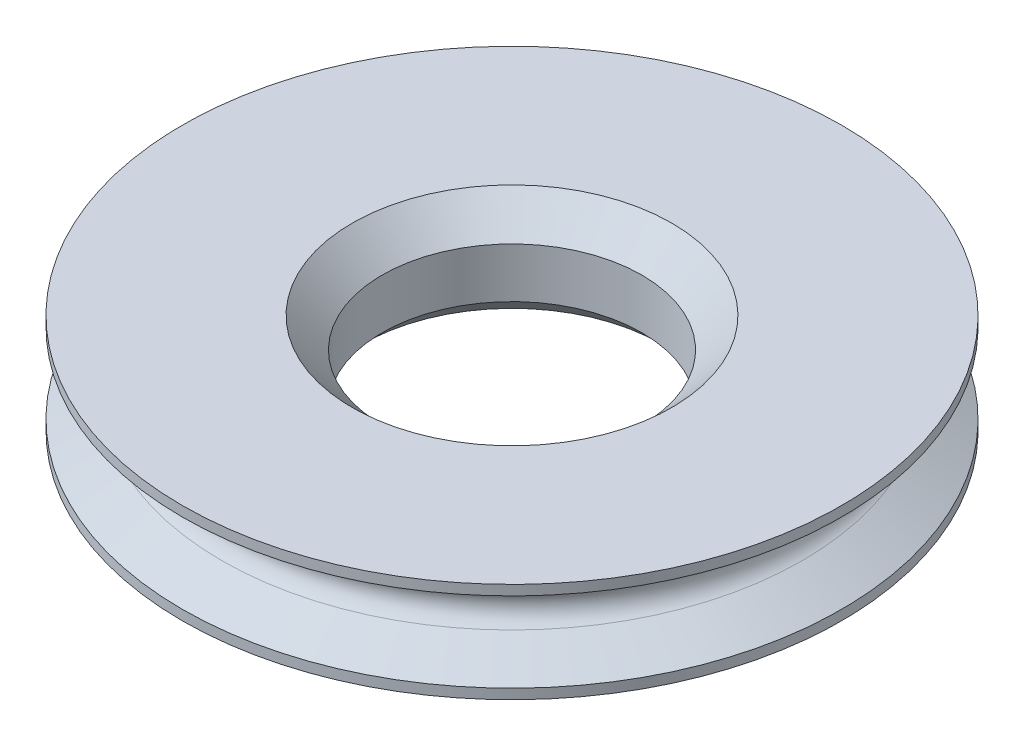
ISO-10303-21;
HEADER;
FILE_DESCRIPTION(('STEP AP214'),'2;1');
FILE_NAME('part.step','',(''),(''),'','','');
FILE_SCHEMA(('AUTOMOTIVE_DESIGN { 1 0 10303 214 1 1 1 1 }'));
ENDSEC;
DATA;
#1=APPLICATION_CONTEXT('core data for automotive mechanical design processes');
#2=APPLICATION_PROTOCOL_DEFINITION('international standard','automotive_design',2000,#1);
#3=PRODUCT_CONTEXT('',#1,'mechanical');
#4=PRODUCT('Part','Part','',(#3));
#5=PRODUCT_RELATED_PRODUCT_CATEGORY('part','',(#4));
#6=PRODUCT_DEFINITION_FORMATION('','',#4);
#7=PRODUCT_DEFINITION_CONTEXT('part definition',#1,'design');
#8=PRODUCT_DEFINITION('design','',#6,#7);
#9=PRODUCT_DEFINITION_SHAPE('','',#8);
#10=(LENGTH_UNIT() NAMED_UNIT(*) SI_UNIT(.MILLI.,.METRE.));
#11=(NAMED_UNIT(*) PLANE_ANGLE_UNIT() SI_UNIT($,.RADIAN.));
#12=(NAMED_UNIT(*) SI_UNIT($,.STERADIAN.) SOLID_ANGLE_UNIT());
#13=UNCERTAINTY_MEASURE_WITH_UNIT(LENGTH_MEASURE(1.E-05),#10,'distance_accuracy_value','');
#14=(GEOMETRIC_REPRESENTATION_CONTEXT(3) GLOBAL_UNCERTAINTY_ASSIGNED_CONTEXT((#13)) GLOBAL_UNIT_ASSIGNED_CONTEXT((#10,
#11,#12)) REPRESENTATION_CONTEXT('',''));
#15=CARTESIAN_POINT('',(0.,0.,0.));
#16=DIRECTION('',(0.,0.,1.));
#17=DIRECTION('',(1.,0.,0.));
#18=AXIS2_PLACEMENT_3D('',#15,#16,#17);
#19=CARTESIAN_POINT('',(41.91,6.35,0.));
#20=DIRECTION('',(0.,-1.,0.));
#21=DIRECTION('',(0.,0.,-1.));
#22=AXIS2_PLACEMENT_3D('',#19,#20,#21);
#23=TOROIDAL_SURFACE('',#22,38.1911818975501,2.54);
#24=CARTESIAN_POINT('',(41.91,8.54970452561248,0.));
#25=DIRECTION('',(0.,-1.,0.));
#26=DIRECTION('',(0.,0.,-1.));
#27=AXIS2_PLACEMENT_3D('',#24,#25,#26);
#28=CIRCLE('',#27,36.9211818975501);
#29=CARTESIAN_POINT('',(41.91,8.54970452561248,-36.9211818975501));
#30=VERTEX_POINT('',#29);
#31=EDGE_CURVE('E74',#30,#30,#28,.T.);
#32=ORIENTED_EDGE('',*,*,#31,.T.);
#33=EDGE_LOOP('',(#32));
#34=FACE_BOUND('',#33,.T.);
#35=CARTESIAN_POINT('',(41.91,4.15029547438753,0.));
#36=DIRECTION('',(0.,-1.,0.));
#37=DIRECTION('',(0.,0.,-1.));
#38=AXIS2_PLACEMENT_3D('',#35,#36,#37);
#39=CIRCLE('',#38,36.9211818975501);
#40=CARTESIAN_POINT('',(41.91,4.15029547438753,-36.9211818975501));
#41=VERTEX_POINT('',#40);
#42=EDGE_CURVE('E10',#41,#41,#39,.T.);
#43=ORIENTED_EDGE('',*,*,#42,.F.);
#44=EDGE_LOOP('',(#43));
#45=FACE_BOUND('',#44,.T.);
#46=ADVANCED_FACE('F40',(#34,#45),#23,.F.);
#47=CARTESIAN_POINT('',(41.91,4.15029547438753,0.));
#48=DIRECTION('',(0.,-1.,0.));
#49=DIRECTION('',(0.,0.,-1.));
#50=AXIS2_PLACEMENT_3D('',#47,#48,#49);
#51=CONICAL_SURFACE('',#50,36.9211818975501,1.0471975511966);
#52=CARTESIAN_POINT('',(41.91,1.27,0.));
#53=DIRECTION('',(0.,-1.,0.));
#54=DIRECTION('',(0.,0.,-1.));
#55=AXIS2_PLACEMENT_3D('',#52,#53,#54);
#56=CIRCLE('',#55,41.91);
#57=CARTESIAN_POINT('',(41.91,1.27,-41.91));
#58=VERTEX_POINT('',#57);
#59=EDGE_CURVE('E46',#58,#58,#56,.T.);
#60=ORIENTED_EDGE('',*,*,#59,.F.);
#61=EDGE_LOOP('',(#60));
#62=FACE_BOUND('',#61,.T.);
#63=ORIENTED_EDGE('',*,*,#42,.T.);
#64=EDGE_LOOP('',(#63));
#65=FACE_BOUND('',#64,.T.);
#66=ADVANCED_FACE('F92',(#62,#65),#51,.T.);
#67=CARTESIAN_POINT('',(41.91,0.,0.));
#68=DIRECTION('',(0.,-1.,0.));
#69=DIRECTION('',(0.,0.,-1.));
#70=AXIS2_PLACEMENT_3D('',#67,#68,#69);
#71=CYLINDRICAL_SURFACE('',#70,41.91);
#72=ORIENTED_EDGE('',*,*,#59,.T.);
#73=EDGE_LOOP('',(#72));
#74=FACE_BOUND('',#73,.T.);
#75=CARTESIAN_POINT('',(41.91,0.,0.));
#76=DIRECTION('',(0.,-1.,0.));
#77=DIRECTION('',(0.,0.,-1.));
#78=AXIS2_PLACEMENT_3D('',#75,#76,#77);
#79=CIRCLE('',#78,41.91);
#80=CARTESIAN_POINT('',(41.91,0.,-41.91));
#81=VERTEX_POINT('',#80);
#82=EDGE_CURVE('E50',#81,#81,#79,.T.);
#83=ORIENTED_EDGE('',*,*,#82,.F.);
#84=EDGE_LOOP('',(#83));
#85=FACE_BOUND('',#84,.T.);
#86=ADVANCED_FACE('F96',(#74,#85),#71,.T.);
#87=CARTESIAN_POINT('',(0.,0.,0.));
#88=DIRECTION('',(0.,1.,0.));
#89=DIRECTION('',(0.,0.,1.));
#90=AXIS2_PLACEMENT_3D('',#87,#88,#89);
#91=PLANE('',#90);
#92=CARTESIAN_POINT('',(41.91,0.,0.));
#93=DIRECTION('',(0.,-1.,0.));
#94=DIRECTION('',(0.,0.,-1.));
#95=AXIS2_PLACEMENT_3D('',#92,#93,#94);
#96=CIRCLE('',#95,19.05);
#97=CARTESIAN_POINT('',(41.91,0.,-19.05));
#98=VERTEX_POINT('',#97);
#99=EDGE_CURVE('E54',#98,#98,#96,.T.);
#100=ORIENTED_EDGE('',*,*,#99,.F.);
#101=EDGE_LOOP('',(#100));
#102=FACE_BOUND('',#101,.T.);
#103=ORIENTED_EDGE('',*,*,#82,.T.);
#104=EDGE_LOOP('',(#103));
#105=FACE_BOUND('',#104,.T.);
#106=ADVANCED_FACE('F101',(#102,#105),#91,.F.);
#107=CARTESIAN_POINT('',(41.91,0.,0.));
#108=DIRECTION('',(0.,-1.,0.));
#109=DIRECTION('',(0.,0.,-1.));
#110=AXIS2_PLACEMENT_3D('',#107,#108,#109);
#111=CONICAL_SURFACE('',#110,19.05,0.785398163397444);
#112=CARTESIAN_POINT('',(41.91,2.54000000000001,0.));
#113=DIRECTION('',(0.,-1.,0.));
#114=DIRECTION('',(0.,0.,-1.));
#115=AXIS2_PLACEMENT_3D('',#112,#113,#114);
#116=CIRCLE('',#115,16.51);
#117=CARTESIAN_POINT('',(41.91,2.54000000000001,-16.51));
#118=VERTEX_POINT('',#117);
#119=EDGE_CURVE('E59',#118,#118,#116,.T.);
#120=ORIENTED_EDGE('',*,*,#119,.F.);
#121=EDGE_LOOP('',(#120));
#122=FACE_BOUND('',#121,.T.);
#123=ORIENTED_EDGE('',*,*,#99,.T.);
#124=EDGE_LOOP('',(#123));
#125=FACE_BOUND('',#124,.T.);
#126=ADVANCED_FACE('F106',(#122,#125),#111,.F.);
#127=CARTESIAN_POINT('',(41.91,0.,0.));
#128=DIRECTION('',(0.,-1.,0.));
#129=DIRECTION('',(0.,0.,-1.));
#130=AXIS2_PLACEMENT_3D('',#127,#128,#129);
#131=CYLINDRICAL_SURFACE('',#130,16.51);
#132=ORIENTED_EDGE('',*,*,#119,.T.);
#133=EDGE_LOOP('',(#132));
#134=FACE_BOUND('',#133,.T.);
#135=CARTESIAN_POINT('',(41.91,8.88999999999999,0.));
#136=DIRECTION('',(0.,-1.,0.));
#137=DIRECTION('',(0.,0.,-1.));
#138=AXIS2_PLACEMENT_3D('',#135,#136,#137);
#139=CIRCLE('',#138,16.51);
#140=CARTESIAN_POINT('',(41.91,8.88999999999999,-16.51));
#141=VERTEX_POINT('',#140);
#142=EDGE_CURVE('E62',#141,#141,#139,.T.);
#143=ORIENTED_EDGE('',*,*,#142,.F.);
#144=EDGE_LOOP('',(#143));
#145=FACE_BOUND('',#144,.T.);
#146=ADVANCED_FACE('F110',(#134,#145),#131,.F.);
#147=CARTESIAN_POINT('',(41.91,12.7,0.));
#148=DIRECTION('',(0.,1.,0.));
#149=DIRECTION('',(0.,0.,1.));
#150=AXIS2_PLACEMENT_3D('',#147,#148,#149);
#151=CONICAL_SURFACE('',#150,20.32,0.785398163397447);
#152=ORIENTED_EDGE('',*,*,#142,.T.);
#153=EDGE_LOOP('',(#152));
#154=FACE_BOUND('',#153,.T.);
#155=CARTESIAN_POINT('',(41.91,12.7,0.));
#156=DIRECTION('',(0.,-1.,0.));
#157=DIRECTION('',(0.,0.,-1.));
#158=AXIS2_PLACEMENT_3D('',#155,#156,#157);
#159=CIRCLE('',#158,20.32);
#160=CARTESIAN_POINT('',(41.91,12.7,-20.32));
#161=VERTEX_POINT('',#160);
#162=EDGE_CURVE('E65',#161,#161,#159,.T.);
#163=ORIENTED_EDGE('',*,*,#162,.F.);
#164=EDGE_LOOP('',(#163));
#165=FACE_BOUND('',#164,.T.);
#166=ADVANCED_FACE('F114',(#154,#165),#151,.F.);
#167=CARTESIAN_POINT('',(0.,12.7,0.));
#168=DIRECTION('',(0.,1.,0.));
#169=DIRECTION('',(0.,0.,1.));
#170=AXIS2_PLACEMENT_3D('',#167,#168,#169);
#171=PLANE('',#170);
#172=ORIENTED_EDGE('',*,*,#162,.T.);
#173=EDGE_LOOP('',(#172));
#174=FACE_BOUND('',#173,.T.);
#175=CARTESIAN_POINT('',(41.91,12.7,0.));
#176=DIRECTION('',(0.,-1.,0.));
#177=DIRECTION('',(0.,0.,-1.));
#178=AXIS2_PLACEMENT_3D('',#175,#176,#177);
#179=CIRCLE('',#178,41.91);
#180=CARTESIAN_POINT('',(41.91,12.7,-41.91));
#181=VERTEX_POINT('',#180);
#182=EDGE_CURVE('E68',#181,#181,#179,.T.);
#183=ORIENTED_EDGE('',*,*,#182,.F.);
#184=EDGE_LOOP('',(#183));
#185=FACE_BOUND('',#184,.T.);
#186=ADVANCED_FACE('F88',(#174,#185),#171,.T.);
#187=CARTESIAN_POINT('',(41.91,0.,0.));
#188=DIRECTION('',(0.,-1.,0.));
#189=DIRECTION('',(0.,0.,-1.));
#190=AXIS2_PLACEMENT_3D('',#187,#188,#189);
#191=CYLINDRICAL_SURFACE('',#190,41.91);
#192=ORIENTED_EDGE('',*,*,#182,.T.);
#193=EDGE_LOOP('',(#192));
#194=FACE_BOUND('',#193,.T.);
#195=CARTESIAN_POINT('',(41.91,11.43,0.));
#196=DIRECTION('',(0.,-1.,0.));
#197=DIRECTION('',(0.,0.,-1.));
#198=AXIS2_PLACEMENT_3D('',#195,#196,#197);
#199=CIRCLE('',#198,41.91);
#200=CARTESIAN_POINT('',(41.91,11.43,-41.91));
#201=VERTEX_POINT('',#200);
#202=EDGE_CURVE('E71',#201,#201,#199,.T.);
#203=ORIENTED_EDGE('',*,*,#202,.F.);
#204=EDGE_LOOP('',(#203));
#205=FACE_BOUND('',#204,.T.);
#206=ADVANCED_FACE('F82',(#194,#205),#191,.T.);
#207=CARTESIAN_POINT('',(41.91,8.54970452561248,0.));
#208=DIRECTION('',(0.,1.,0.));
#209=DIRECTION('',(0.,0.,1.));
#210=AXIS2_PLACEMENT_3D('',#207,#208,#209);
#211=CONICAL_SURFACE('',#210,36.9211818975501,1.0471975511966);
#212=ORIENTED_EDGE('',*,*,#202,.T.);
#213=EDGE_LOOP('',(#212));
#214=FACE_BOUND('',#213,.T.);
#215=ORIENTED_EDGE('',*,*,#31,.F.);
#216=EDGE_LOOP('',(#215));
#217=FACE_BOUND('',#216,.T.);
#218=ADVANCED_FACE('F80',(#214,#217),#211,.T.);
#219=CLOSED_SHELL('',(#46,#66,#86,#106,#126,#146,#166,#186,#206,#218));
#220=MANIFOLD_SOLID_BREP('B2',#219);
#221=ADVANCED_BREP_SHAPE_REPRESENTATION('',(#18,#220),#14);
#222=SHAPE_DEFINITION_REPRESENTATION(#9,#221);
ENDSEC;
END-ISO-10303-21;
